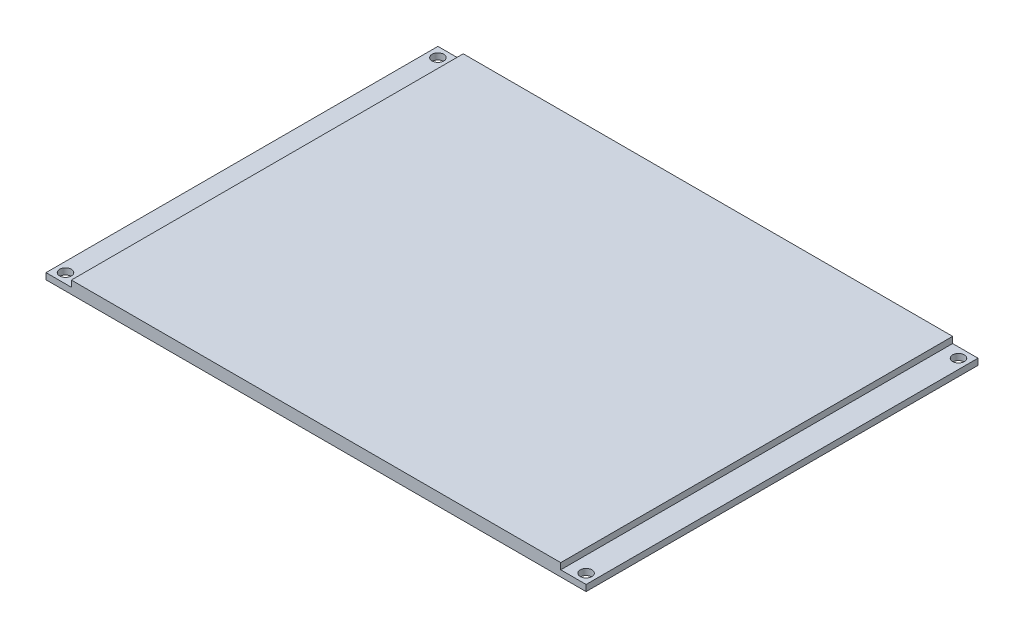
ISO-10303-21;
HEADER;
FILE_DESCRIPTION(('STEP AP214'),'2;1');
FILE_NAME('part.step','',(''),(''),'','','');
FILE_SCHEMA(('AUTOMOTIVE_DESIGN { 1 0 10303 214 1 1 1 1 }'));
ENDSEC;
DATA;
#1=APPLICATION_CONTEXT('core data for automotive mechanical design processes');
#2=APPLICATION_PROTOCOL_DEFINITION('international standard','automotive_design',2000,#1);
#3=PRODUCT_CONTEXT('',#1,'mechanical');
#4=PRODUCT('Part','Part','',(#3));
#5=PRODUCT_RELATED_PRODUCT_CATEGORY('part','',(#4));
#6=PRODUCT_DEFINITION_FORMATION('','',#4);
#7=PRODUCT_DEFINITION_CONTEXT('part definition',#1,'design');
#8=PRODUCT_DEFINITION('design','',#6,#7);
#9=PRODUCT_DEFINITION_SHAPE('','',#8);
#10=(LENGTH_UNIT() NAMED_UNIT(*) SI_UNIT(.MILLI.,.METRE.));
#11=(NAMED_UNIT(*) PLANE_ANGLE_UNIT() SI_UNIT($,.RADIAN.));
#12=(NAMED_UNIT(*) SI_UNIT($,.STERADIAN.) SOLID_ANGLE_UNIT());
#13=UNCERTAINTY_MEASURE_WITH_UNIT(LENGTH_MEASURE(1.E-05),#10,'distance_accuracy_value','');
#14=(GEOMETRIC_REPRESENTATION_CONTEXT(3) GLOBAL_UNCERTAINTY_ASSIGNED_CONTEXT((#13)) GLOBAL_UNIT_ASSIGNED_CONTEXT((#10,
#11,#12)) REPRESENTATION_CONTEXT('',''));
#15=CARTESIAN_POINT('',(0.,0.,0.));
#16=DIRECTION('',(0.,0.,1.));
#17=DIRECTION('',(1.,0.,0.));
#18=AXIS2_PLACEMENT_3D('',#15,#16,#17);
#19=CARTESIAN_POINT('',(0.,0.,0.));
#20=DIRECTION('',(0.,1.,0.));
#21=DIRECTION('',(0.,0.,1.));
#22=AXIS2_PLACEMENT_3D('',#19,#20,#21);
#23=PLANE('',#22);
#24=CARTESIAN_POINT('',(-66.7499999999999,0.,47.75));
#25=DIRECTION('',(0.,1.,0.));
#26=DIRECTION('',(0.,0.,1.));
#27=AXIS2_PLACEMENT_3D('',#24,#25,#26);
#28=CIRCLE('',#27,1.5);
#29=CARTESIAN_POINT('',(-66.7499999999999,0.,49.25));
#30=VERTEX_POINT('',#29);
#31=EDGE_CURVE('E185',#30,#30,#28,.F.);
#32=ORIENTED_EDGE('',*,*,#31,.F.);
#33=EDGE_LOOP('',(#32));
#34=FACE_BOUND('',#33,.T.);
#35=DIRECTION('',(1.,0.,0.));
#36=VECTOR('',#35,1.);
#37=CARTESIAN_POINT('',(0.,0.,50.25));
#38=LINE('',#37,#36);
#39=CARTESIAN_POINT('',(-69.25,0.,50.25));
#40=VERTEX_POINT('',#39);
#41=CARTESIAN_POINT('',(69.25,0.,50.25));
#42=VERTEX_POINT('',#41);
#43=EDGE_CURVE('E216',#40,#42,#38,.T.);
#44=ORIENTED_EDGE('',*,*,#43,.F.);
#45=DIRECTION('',(0.,0.,-1.));
#46=VECTOR('',#45,1.);
#47=CARTESIAN_POINT('',(-69.25,0.,0.));
#48=LINE('',#47,#46);
#49=CARTESIAN_POINT('',(-69.25,0.,-50.25));
#50=VERTEX_POINT('',#49);
#51=EDGE_CURVE('E225',#40,#50,#48,.T.);
#52=ORIENTED_EDGE('',*,*,#51,.T.);
#53=DIRECTION('',(1.,0.,0.));
#54=VECTOR('',#53,1.);
#55=CARTESIAN_POINT('',(0.,0.,-50.25));
#56=LINE('',#55,#54);
#57=CARTESIAN_POINT('',(69.25,0.,-50.25));
#58=VERTEX_POINT('',#57);
#59=EDGE_CURVE('E222',#50,#58,#56,.T.);
#60=ORIENTED_EDGE('',*,*,#59,.T.);
#61=DIRECTION('',(0.,0.,-1.));
#62=VECTOR('',#61,1.);
#63=CARTESIAN_POINT('',(69.25,0.,0.));
#64=LINE('',#63,#62);
#65=EDGE_CURVE('E219',#42,#58,#64,.T.);
#66=ORIENTED_EDGE('',*,*,#65,.F.);
#67=EDGE_LOOP('',(#44,#52,#60,#66));
#68=FACE_BOUND('',#67,.T.);
#69=CARTESIAN_POINT('',(66.75,0.,47.75));
#70=DIRECTION('',(0.,1.,0.));
#71=DIRECTION('',(0.,0.,1.));
#72=AXIS2_PLACEMENT_3D('',#69,#70,#71);
#73=CIRCLE('',#72,1.5);
#74=CARTESIAN_POINT('',(66.75,0.,49.25));
#75=VERTEX_POINT('',#74);
#76=EDGE_CURVE('E213',#75,#75,#73,.T.);
#77=ORIENTED_EDGE('',*,*,#76,.T.);
#78=EDGE_LOOP('',(#77));
#79=FACE_BOUND('',#78,.T.);
#80=CARTESIAN_POINT('',(66.75,0.,-47.75));
#81=DIRECTION('',(0.,1.,0.));
#82=DIRECTION('',(0.,0.,1.));
#83=AXIS2_PLACEMENT_3D('',#80,#81,#82);
#84=CIRCLE('',#83,1.5);
#85=CARTESIAN_POINT('',(66.75,0.,-46.25));
#86=VERTEX_POINT('',#85);
#87=EDGE_CURVE('E210',#86,#86,#84,.F.);
#88=ORIENTED_EDGE('',*,*,#87,.F.);
#89=EDGE_LOOP('',(#88));
#90=FACE_BOUND('',#89,.T.);
#91=CARTESIAN_POINT('',(-66.7499999999999,0.,-47.75));
#92=DIRECTION('',(0.,1.,0.));
#93=DIRECTION('',(0.,0.,1.));
#94=AXIS2_PLACEMENT_3D('',#91,#92,#93);
#95=CIRCLE('',#94,1.5);
#96=CARTESIAN_POINT('',(-66.7499999999999,0.,-46.25));
#97=VERTEX_POINT('',#96);
#98=EDGE_CURVE('E180',#97,#97,#95,.T.);
#99=ORIENTED_EDGE('',*,*,#98,.T.);
#100=EDGE_LOOP('',(#99));
#101=FACE_BOUND('',#100,.T.);
#102=DIRECTION('',(0.,0.,1.));
#103=VECTOR('',#102,1.);
#104=CARTESIAN_POINT('',(55.75,0.,10.25));
#105=LINE('',#104,#103);
#106=CARTESIAN_POINT('',(55.75,0.,-9.75000000000001));
#107=VERTEX_POINT('',#106);
#108=CARTESIAN_POINT('',(55.75,0.,10.25));
#109=VERTEX_POINT('',#108);
#110=EDGE_CURVE('E147',#107,#109,#105,.T.);
#111=ORIENTED_EDGE('',*,*,#110,.F.);
#112=DIRECTION('',(1.,0.,0.));
#113=VECTOR('',#112,1.);
#114=CARTESIAN_POINT('',(47.75,0.,-9.75000000000001));
#115=LINE('',#114,#113);
#116=CARTESIAN_POINT('',(47.75,0.,-9.75000000000001));
#117=VERTEX_POINT('',#116);
#118=EDGE_CURVE('E144',#117,#107,#115,.T.);
#119=ORIENTED_EDGE('',*,*,#118,.F.);
#120=DIRECTION('',(0.,0.,-1.));
#121=VECTOR('',#120,1.);
#122=CARTESIAN_POINT('',(47.75,0.,10.25));
#123=LINE('',#122,#121);
#124=CARTESIAN_POINT('',(47.75,0.,10.25));
#125=VERTEX_POINT('',#124);
#126=EDGE_CURVE('E58',#125,#117,#123,.T.);
#127=ORIENTED_EDGE('',*,*,#126,.F.);
#128=DIRECTION('',(-1.,0.,0.));
#129=VECTOR('',#128,1.);
#130=CARTESIAN_POINT('',(47.75,0.,10.25));
#131=LINE('',#130,#129);
#132=EDGE_CURVE('E53',#109,#125,#131,.T.);
#133=ORIENTED_EDGE('',*,*,#132,.F.);
#134=EDGE_LOOP('',(#111,#119,#127,#133));
#135=FACE_BOUND('',#134,.T.);
#136=ADVANCED_FACE('F38',(#34,#68,#79,#90,#101,#135),#23,.F.);
#137=CARTESIAN_POINT('',(0.,1.6,0.));
#138=DIRECTION('',(0.,1.,0.));
#139=DIRECTION('',(0.,0.,1.));
#140=AXIS2_PLACEMENT_3D('',#137,#138,#139);
#141=PLANE('',#140);
#142=DIRECTION('',(0.,0.,-1.));
#143=VECTOR('',#142,1.);
#144=CARTESIAN_POINT('',(62.75,1.6,50.25));
#145=LINE('',#144,#143);
#146=CARTESIAN_POINT('',(62.75,1.6,50.25));
#147=VERTEX_POINT('',#146);
#148=CARTESIAN_POINT('',(62.75,1.6,-50.25));
#149=VERTEX_POINT('',#148);
#150=EDGE_CURVE('E151',#147,#149,#145,.T.);
#151=ORIENTED_EDGE('',*,*,#150,.F.);
#152=DIRECTION('',(1.,0.,0.));
#153=VECTOR('',#152,1.);
#154=CARTESIAN_POINT('',(0.,1.6,50.25));
#155=LINE('',#154,#153);
#156=CARTESIAN_POINT('',(69.25,1.6,50.25));
#157=VERTEX_POINT('',#156);
#158=EDGE_CURVE('E191',#147,#157,#155,.T.);
#159=ORIENTED_EDGE('',*,*,#158,.T.);
#160=DIRECTION('',(0.,0.,-1.));
#161=VECTOR('',#160,1.);
#162=CARTESIAN_POINT('',(69.25,1.6,0.));
#163=LINE('',#162,#161);
#164=CARTESIAN_POINT('',(69.25,1.6,-50.25));
#165=VERTEX_POINT('',#164);
#166=EDGE_CURVE('E194',#157,#165,#163,.T.);
#167=ORIENTED_EDGE('',*,*,#166,.T.);
#168=DIRECTION('',(1.,0.,0.));
#169=VECTOR('',#168,1.);
#170=CARTESIAN_POINT('',(0.,1.6,-50.25));
#171=LINE('',#170,#169);
#172=EDGE_CURVE('E197',#149,#165,#171,.T.);
#173=ORIENTED_EDGE('',*,*,#172,.F.);
#174=EDGE_LOOP('',(#151,#159,#167,#173));
#175=FACE_BOUND('',#174,.T.);
#176=CARTESIAN_POINT('',(66.75,1.6,47.75));
#177=DIRECTION('',(0.,1.,0.));
#178=DIRECTION('',(0.,0.,1.));
#179=AXIS2_PLACEMENT_3D('',#176,#177,#178);
#180=CIRCLE('',#179,1.5);
#181=CARTESIAN_POINT('',(66.75,1.6,49.25));
#182=VERTEX_POINT('',#181);
#183=EDGE_CURVE('E188',#182,#182,#180,.T.);
#184=ORIENTED_EDGE('',*,*,#183,.F.);
#185=EDGE_LOOP('',(#184));
#186=FACE_BOUND('',#185,.T.);
#187=CARTESIAN_POINT('',(66.75,1.6,-47.75));
#188=DIRECTION('',(0.,1.,0.));
#189=DIRECTION('',(0.,0.,1.));
#190=AXIS2_PLACEMENT_3D('',#187,#188,#189);
#191=CIRCLE('',#190,1.5);
#192=CARTESIAN_POINT('',(66.75,1.6,-46.25));
#193=VERTEX_POINT('',#192);
#194=EDGE_CURVE('E184',#193,#193,#191,.F.);
#195=ORIENTED_EDGE('',*,*,#194,.T.);
#196=EDGE_LOOP('',(#195));
#197=FACE_BOUND('',#196,.T.);
#198=ADVANCED_FACE('F269',(#175,#186,#197),#141,.T.);
#199=CARTESIAN_POINT('',(0.,1.6,50.25));
#200=DIRECTION('',(0.,0.,-1.));
#201=DIRECTION('',(-1.,0.,0.));
#202=AXIS2_PLACEMENT_3D('',#199,#200,#201);
#203=PLANE('',#202);
#204=ORIENTED_EDGE('',*,*,#43,.T.);
#205=DIRECTION('',(0.,-1.,0.));
#206=VECTOR('',#205,1.);
#207=CARTESIAN_POINT('',(69.25,1.6,50.25));
#208=LINE('',#207,#206);
#209=EDGE_CURVE('E11',#157,#42,#208,.T.);
#210=ORIENTED_EDGE('',*,*,#209,.F.);
#211=ORIENTED_EDGE('',*,*,#158,.F.);
#212=DIRECTION('',(0.,-1.,0.));
#213=VECTOR('',#212,1.);
#214=CARTESIAN_POINT('',(62.75,3.2,50.25));
#215=LINE('',#214,#213);
#216=CARTESIAN_POINT('',(62.75,3.2,50.25));
#217=VERTEX_POINT('',#216);
#218=EDGE_CURVE('E171',#217,#147,#215,.T.);
#219=ORIENTED_EDGE('',*,*,#218,.F.);
#220=DIRECTION('',(1.,0.,0.));
#221=VECTOR('',#220,1.);
#222=CARTESIAN_POINT('',(-62.75,3.2,50.25));
#223=LINE('',#222,#221);
#224=CARTESIAN_POINT('',(-62.75,3.2,50.25));
#225=VERTEX_POINT('',#224);
#226=EDGE_CURVE('E162',#225,#217,#223,.T.);
#227=ORIENTED_EDGE('',*,*,#226,.F.);
#228=DIRECTION('',(0.,-1.,0.));
#229=VECTOR('',#228,1.);
#230=CARTESIAN_POINT('',(-62.75,3.2,50.25));
#231=LINE('',#230,#229);
#232=CARTESIAN_POINT('',(-62.75,1.6,50.25));
#233=VERTEX_POINT('',#232);
#234=EDGE_CURVE('E174',#225,#233,#231,.T.);
#235=ORIENTED_EDGE('',*,*,#234,.T.);
#236=CARTESIAN_POINT('',(-69.25,1.6,50.25));
#237=VERTEX_POINT('',#236);
#238=EDGE_CURVE('E192',#237,#233,#155,.T.);
#239=ORIENTED_EDGE('',*,*,#238,.F.);
#240=DIRECTION('',(0.,-1.,0.));
#241=VECTOR('',#240,1.);
#242=CARTESIAN_POINT('',(-69.25,1.6,50.25));
#243=LINE('',#242,#241);
#244=EDGE_CURVE('E207',#237,#40,#243,.T.);
#245=ORIENTED_EDGE('',*,*,#244,.T.);
#246=EDGE_LOOP('',(#204,#210,#211,#219,#227,#235,#239,#245));
#247=FACE_BOUND('',#246,.T.);
#248=ADVANCED_FACE('F258',(#247),#203,.F.);
#249=CARTESIAN_POINT('',(69.25,1.6,0.));
#250=DIRECTION('',(-1.,0.,0.));
#251=DIRECTION('',(0.,0.,1.));
#252=AXIS2_PLACEMENT_3D('',#249,#250,#251);
#253=PLANE('',#252);
#254=ORIENTED_EDGE('',*,*,#65,.T.);
#255=DIRECTION('',(0.,-1.,0.));
#256=VECTOR('',#255,1.);
#257=CARTESIAN_POINT('',(69.25,1.6,-50.25));
#258=LINE('',#257,#256);
#259=EDGE_CURVE('E46',#165,#58,#258,.T.);
#260=ORIENTED_EDGE('',*,*,#259,.F.);
#261=ORIENTED_EDGE('',*,*,#166,.F.);
#262=ORIENTED_EDGE('',*,*,#209,.T.);
#263=EDGE_LOOP('',(#254,#260,#261,#262));
#264=FACE_BOUND('',#263,.T.);
#265=ADVANCED_FACE('F238',(#264),#253,.F.);
#266=CARTESIAN_POINT('',(0.,1.6,-50.25));
#267=DIRECTION('',(0.,0.,-1.));
#268=DIRECTION('',(-1.,0.,0.));
#269=AXIS2_PLACEMENT_3D('',#266,#267,#268);
#270=PLANE('',#269);
#271=ORIENTED_EDGE('',*,*,#59,.F.);
#272=DIRECTION('',(0.,-1.,0.));
#273=VECTOR('',#272,1.);
#274=CARTESIAN_POINT('',(-69.25,1.6,-50.25));
#275=LINE('',#274,#273);
#276=CARTESIAN_POINT('',(-69.25,1.6,-50.25));
#277=VERTEX_POINT('',#276);
#278=EDGE_CURVE('E231',#277,#50,#275,.T.);
#279=ORIENTED_EDGE('',*,*,#278,.F.);
#280=CARTESIAN_POINT('',(-62.75,1.6,-50.25));
#281=VERTEX_POINT('',#280);
#282=EDGE_CURVE('E198',#277,#281,#171,.T.);
#283=ORIENTED_EDGE('',*,*,#282,.T.);
#284=DIRECTION('',(0.,-1.,0.));
#285=VECTOR('',#284,1.);
#286=CARTESIAN_POINT('',(-62.75,3.2,-50.25));
#287=LINE('',#286,#285);
#288=CARTESIAN_POINT('',(-62.75,3.2,-50.25));
#289=VERTEX_POINT('',#288);
#290=EDGE_CURVE('E177',#289,#281,#287,.T.);
#291=ORIENTED_EDGE('',*,*,#290,.F.);
#292=DIRECTION('',(-1.,0.,0.));
#293=VECTOR('',#292,1.);
#294=CARTESIAN_POINT('',(62.75,3.2,-50.25));
#295=LINE('',#294,#293);
#296=CARTESIAN_POINT('',(62.75,3.2,-50.25));
#297=VERTEX_POINT('',#296);
#298=EDGE_CURVE('E157',#297,#289,#295,.T.);
#299=ORIENTED_EDGE('',*,*,#298,.F.);
#300=DIRECTION('',(0.,-1.,0.));
#301=VECTOR('',#300,1.);
#302=CARTESIAN_POINT('',(62.75,3.2,-50.25));
#303=LINE('',#302,#301);
#304=EDGE_CURVE('E165',#297,#149,#303,.T.);
#305=ORIENTED_EDGE('',*,*,#304,.T.);
#306=ORIENTED_EDGE('',*,*,#172,.T.);
#307=ORIENTED_EDGE('',*,*,#259,.T.);
#308=EDGE_LOOP('',(#271,#279,#283,#291,#299,#305,#306,#307));
#309=FACE_BOUND('',#308,.T.);
#310=ADVANCED_FACE('F235',(#309),#270,.T.);
#311=CARTESIAN_POINT('',(-69.25,1.6,0.));
#312=DIRECTION('',(-1.,0.,0.));
#313=DIRECTION('',(0.,0.,1.));
#314=AXIS2_PLACEMENT_3D('',#311,#312,#313);
#315=PLANE('',#314);
#316=ORIENTED_EDGE('',*,*,#51,.F.);
#317=ORIENTED_EDGE('',*,*,#244,.F.);
#318=DIRECTION('',(0.,0.,-1.));
#319=VECTOR('',#318,1.);
#320=CARTESIAN_POINT('',(-69.25,1.6,0.));
#321=LINE('',#320,#319);
#322=EDGE_CURVE('E201',#237,#277,#321,.T.);
#323=ORIENTED_EDGE('',*,*,#322,.T.);
#324=ORIENTED_EDGE('',*,*,#278,.T.);
#325=EDGE_LOOP('',(#316,#317,#323,#324));
#326=FACE_BOUND('',#325,.T.);
#327=ADVANCED_FACE('F245',(#326),#315,.T.);
#328=CARTESIAN_POINT('',(66.75,1.6,47.75));
#329=DIRECTION('',(0.,-1.,0.));
#330=DIRECTION('',(0.,0.,-1.));
#331=AXIS2_PLACEMENT_3D('',#328,#329,#330);
#332=CYLINDRICAL_SURFACE('',#331,1.5);
#333=ORIENTED_EDGE('',*,*,#183,.T.);
#334=EDGE_LOOP('',(#333));
#335=FACE_BOUND('',#334,.T.);
#336=ORIENTED_EDGE('',*,*,#76,.F.);
#337=EDGE_LOOP('',(#336));
#338=FACE_BOUND('',#337,.T.);
#339=ADVANCED_FACE('F280',(#335,#338),#332,.F.);
#340=CARTESIAN_POINT('',(66.75,1.6,-47.75));
#341=DIRECTION('',(0.,-1.,0.));
#342=DIRECTION('',(0.,0.,-1.));
#343=AXIS2_PLACEMENT_3D('',#340,#341,#342);
#344=CYLINDRICAL_SURFACE('',#343,1.5);
#345=ORIENTED_EDGE('',*,*,#194,.F.);
#346=EDGE_LOOP('',(#345));
#347=FACE_BOUND('',#346,.T.);
#348=ORIENTED_EDGE('',*,*,#87,.T.);
#349=EDGE_LOOP('',(#348));
#350=FACE_BOUND('',#349,.T.);
#351=ADVANCED_FACE('F277',(#347,#350),#344,.F.);
#352=CARTESIAN_POINT('',(-66.7499999999999,1.6,-47.75));
#353=DIRECTION('',(0.,-1.,0.));
#354=DIRECTION('',(0.,0.,-1.));
#355=AXIS2_PLACEMENT_3D('',#352,#353,#354);
#356=CYLINDRICAL_SURFACE('',#355,1.5);
#357=CARTESIAN_POINT('',(-66.7499999999999,1.6,-47.75));
#358=DIRECTION('',(0.,1.,0.));
#359=DIRECTION('',(0.,0.,1.));
#360=AXIS2_PLACEMENT_3D('',#357,#358,#359);
#361=CIRCLE('',#360,1.5);
#362=CARTESIAN_POINT('',(-66.7499999999999,1.6,-46.25));
#363=VERTEX_POINT('',#362);
#364=EDGE_CURVE('E181',#363,#363,#361,.T.);
#365=ORIENTED_EDGE('',*,*,#364,.T.);
#366=EDGE_LOOP('',(#365));
#367=FACE_BOUND('',#366,.T.);
#368=ORIENTED_EDGE('',*,*,#98,.F.);
#369=EDGE_LOOP('',(#368));
#370=FACE_BOUND('',#369,.T.);
#371=ADVANCED_FACE('F40',(#367,#370),#356,.F.);
#372=CARTESIAN_POINT('',(-66.7499999999999,1.6,47.75));
#373=DIRECTION('',(0.,-1.,0.));
#374=DIRECTION('',(0.,0.,-1.));
#375=AXIS2_PLACEMENT_3D('',#372,#373,#374);
#376=CYLINDRICAL_SURFACE('',#375,1.5);
#377=CARTESIAN_POINT('',(-66.7499999999999,1.6,47.75));
#378=DIRECTION('',(0.,1.,0.));
#379=DIRECTION('',(0.,0.,1.));
#380=AXIS2_PLACEMENT_3D('',#377,#378,#379);
#381=CIRCLE('',#380,1.5);
#382=CARTESIAN_POINT('',(-66.7499999999999,1.6,49.25));
#383=VERTEX_POINT('',#382);
#384=EDGE_CURVE('E204',#383,#383,#381,.F.);
#385=ORIENTED_EDGE('',*,*,#384,.F.);
#386=EDGE_LOOP('',(#385));
#387=FACE_BOUND('',#386,.T.);
#388=ORIENTED_EDGE('',*,*,#31,.T.);
#389=EDGE_LOOP('',(#388));
#390=FACE_BOUND('',#389,.T.);
#391=ADVANCED_FACE('F321',(#387,#390),#376,.F.);
#392=DIRECTION('',(0.,0.,1.));
#393=VECTOR('',#392,1.);
#394=CARTESIAN_POINT('',(-62.75,1.6,-50.25));
#395=LINE('',#394,#393);
#396=EDGE_CURVE('E148',#281,#233,#395,.T.);
#397=ORIENTED_EDGE('',*,*,#396,.F.);
#398=ORIENTED_EDGE('',*,*,#282,.F.);
#399=ORIENTED_EDGE('',*,*,#322,.F.);
#400=ORIENTED_EDGE('',*,*,#238,.T.);
#401=EDGE_LOOP('',(#397,#398,#399,#400));
#402=FACE_BOUND('',#401,.T.);
#403=ORIENTED_EDGE('',*,*,#364,.F.);
#404=EDGE_LOOP('',(#403));
#405=FACE_BOUND('',#404,.T.);
#406=ORIENTED_EDGE('',*,*,#384,.T.);
#407=EDGE_LOOP('',(#406));
#408=FACE_BOUND('',#407,.T.);
#409=ADVANCED_FACE('F251',(#402,#405,#408),#141,.T.);
#410=CARTESIAN_POINT('',(-62.75,3.2,-50.25));
#411=DIRECTION('',(1.,0.,0.));
#412=DIRECTION('',(0.,0.,-1.));
#413=AXIS2_PLACEMENT_3D('',#410,#411,#412);
#414=PLANE('',#413);
#415=ORIENTED_EDGE('',*,*,#396,.T.);
#416=ORIENTED_EDGE('',*,*,#234,.F.);
#417=DIRECTION('',(0.,0.,1.));
#418=VECTOR('',#417,1.);
#419=CARTESIAN_POINT('',(-62.75,3.2,-50.25));
#420=LINE('',#419,#418);
#421=EDGE_CURVE('E160',#289,#225,#420,.T.);
#422=ORIENTED_EDGE('',*,*,#421,.F.);
#423=ORIENTED_EDGE('',*,*,#290,.T.);
#424=EDGE_LOOP('',(#415,#416,#422,#423));
#425=FACE_BOUND('',#424,.T.);
#426=ADVANCED_FACE('F255',(#425),#414,.F.);
#427=CARTESIAN_POINT('',(62.75,3.2,50.25));
#428=DIRECTION('',(-1.,0.,0.));
#429=DIRECTION('',(0.,0.,1.));
#430=AXIS2_PLACEMENT_3D('',#427,#428,#429);
#431=PLANE('',#430);
#432=ORIENTED_EDGE('',*,*,#150,.T.);
#433=ORIENTED_EDGE('',*,*,#304,.F.);
#434=DIRECTION('',(0.,0.,-1.));
#435=VECTOR('',#434,1.);
#436=CARTESIAN_POINT('',(62.75,3.2,50.25));
#437=LINE('',#436,#435);
#438=EDGE_CURVE('E164',#217,#297,#437,.T.);
#439=ORIENTED_EDGE('',*,*,#438,.F.);
#440=ORIENTED_EDGE('',*,*,#218,.T.);
#441=EDGE_LOOP('',(#432,#433,#439,#440));
#442=FACE_BOUND('',#441,.T.);
#443=ADVANCED_FACE('F267',(#442),#431,.F.);
#444=CARTESIAN_POINT('',(0.,3.2,0.));
#445=DIRECTION('',(0.,1.,0.));
#446=DIRECTION('',(0.,0.,1.));
#447=AXIS2_PLACEMENT_3D('',#444,#445,#446);
#448=PLANE('',#447);
#449=ORIENTED_EDGE('',*,*,#298,.T.);
#450=ORIENTED_EDGE('',*,*,#421,.T.);
#451=ORIENTED_EDGE('',*,*,#226,.T.);
#452=ORIENTED_EDGE('',*,*,#438,.T.);
#453=EDGE_LOOP('',(#449,#450,#451,#452));
#454=FACE_BOUND('',#453,.T.);
#455=ADVANCED_FACE('F263',(#454),#448,.T.);
#456=CARTESIAN_POINT('',(55.75,-6.,10.25));
#457=DIRECTION('',(-1.,0.,0.));
#458=DIRECTION('',(0.,0.,1.));
#459=AXIS2_PLACEMENT_3D('',#456,#457,#458);
#460=PLANE('',#459);
#461=ORIENTED_EDGE('',*,*,#110,.T.);
#462=DIRECTION('',(0.,1.,0.));
#463=VECTOR('',#462,1.);
#464=CARTESIAN_POINT('',(55.75,-6.,10.25));
#465=LINE('',#464,#463);
#466=CARTESIAN_POINT('',(55.75,-6.,10.25));
#467=VERTEX_POINT('',#466);
#468=EDGE_CURVE('E128',#467,#109,#465,.T.);
#469=ORIENTED_EDGE('',*,*,#468,.F.);
#470=DIRECTION('',(0.,0.,1.));
#471=VECTOR('',#470,1.);
#472=CARTESIAN_POINT('',(55.75,-6.,10.25));
#473=LINE('',#472,#471);
#474=CARTESIAN_POINT('',(55.75,-6.,-9.75000000000001));
#475=VERTEX_POINT('',#474);
#476=EDGE_CURVE('E135',#475,#467,#473,.T.);
#477=ORIENTED_EDGE('',*,*,#476,.F.);
#478=DIRECTION('',(0.,1.,0.));
#479=VECTOR('',#478,1.);
#480=CARTESIAN_POINT('',(55.75,-6.,-9.75000000000001));
#481=LINE('',#480,#479);
#482=EDGE_CURVE('E293',#475,#107,#481,.T.);
#483=ORIENTED_EDGE('',*,*,#482,.T.);
#484=EDGE_LOOP('',(#461,#469,#477,#483));
#485=FACE_BOUND('',#484,.T.);
#486=ADVANCED_FACE('F146',(#485),#460,.F.);
#487=CARTESIAN_POINT('',(47.75,-6.,10.25));
#488=DIRECTION('',(0.,0.,-1.));
#489=DIRECTION('',(-1.,0.,0.));
#490=AXIS2_PLACEMENT_3D('',#487,#488,#489);
#491=PLANE('',#490);
#492=ORIENTED_EDGE('',*,*,#132,.T.);
#493=DIRECTION('',(0.,1.,0.));
#494=VECTOR('',#493,1.);
#495=CARTESIAN_POINT('',(47.75,-6.,10.25));
#496=LINE('',#495,#494);
#497=CARTESIAN_POINT('',(47.75,-6.,10.25));
#498=VERTEX_POINT('',#497);
#499=EDGE_CURVE('E131',#498,#125,#496,.T.);
#500=ORIENTED_EDGE('',*,*,#499,.F.);
#501=DIRECTION('',(-1.,0.,0.));
#502=VECTOR('',#501,1.);
#503=CARTESIAN_POINT('',(47.75,-6.,10.25));
#504=LINE('',#503,#502);
#505=EDGE_CURVE('E124',#467,#498,#504,.T.);
#506=ORIENTED_EDGE('',*,*,#505,.F.);
#507=ORIENTED_EDGE('',*,*,#468,.T.);
#508=EDGE_LOOP('',(#492,#500,#506,#507));
#509=FACE_BOUND('',#508,.T.);
#510=ADVANCED_FACE('F126',(#509),#491,.F.);
#511=CARTESIAN_POINT('',(47.75,-6.,10.25));
#512=DIRECTION('',(1.,0.,0.));
#513=DIRECTION('',(0.,0.,-1.));
#514=AXIS2_PLACEMENT_3D('',#511,#512,#513);
#515=PLANE('',#514);
#516=ORIENTED_EDGE('',*,*,#126,.T.);
#517=DIRECTION('',(0.,1.,0.));
#518=VECTOR('',#517,1.);
#519=CARTESIAN_POINT('',(47.75,-6.,-9.75000000000001));
#520=LINE('',#519,#518);
#521=CARTESIAN_POINT('',(47.75,-6.,-9.75000000000001));
#522=VERTEX_POINT('',#521);
#523=EDGE_CURVE('E153',#522,#117,#520,.T.);
#524=ORIENTED_EDGE('',*,*,#523,.F.);
#525=DIRECTION('',(0.,0.,-1.));
#526=VECTOR('',#525,1.);
#527=CARTESIAN_POINT('',(47.75,-6.,10.25));
#528=LINE('',#527,#526);
#529=EDGE_CURVE('E134',#498,#522,#528,.T.);
#530=ORIENTED_EDGE('',*,*,#529,.F.);
#531=ORIENTED_EDGE('',*,*,#499,.T.);
#532=EDGE_LOOP('',(#516,#524,#530,#531));
#533=FACE_BOUND('',#532,.T.);
#534=ADVANCED_FACE('F302',(#533),#515,.F.);
#535=CARTESIAN_POINT('',(47.75,-6.,-9.75000000000001));
#536=DIRECTION('',(0.,0.,1.));
#537=DIRECTION('',(1.,0.,0.));
#538=AXIS2_PLACEMENT_3D('',#535,#536,#537);
#539=PLANE('',#538);
#540=ORIENTED_EDGE('',*,*,#118,.T.);
#541=ORIENTED_EDGE('',*,*,#482,.F.);
#542=DIRECTION('',(1.,0.,0.));
#543=VECTOR('',#542,1.);
#544=CARTESIAN_POINT('',(47.75,-6.,-9.75000000000001));
#545=LINE('',#544,#543);
#546=EDGE_CURVE('E140',#522,#475,#545,.T.);
#547=ORIENTED_EDGE('',*,*,#546,.F.);
#548=ORIENTED_EDGE('',*,*,#523,.T.);
#549=EDGE_LOOP('',(#540,#541,#547,#548));
#550=FACE_BOUND('',#549,.T.);
#551=ADVANCED_FACE('F292',(#550),#539,.F.);
#552=CARTESIAN_POINT('',(0.,-6.,0.));
#553=DIRECTION('',(0.,-1.,0.));
#554=DIRECTION('',(0.,0.,-1.));
#555=AXIS2_PLACEMENT_3D('',#552,#553,#554);
#556=PLANE('',#555);
#557=ORIENTED_EDGE('',*,*,#476,.T.);
#558=ORIENTED_EDGE('',*,*,#505,.T.);
#559=ORIENTED_EDGE('',*,*,#529,.T.);
#560=ORIENTED_EDGE('',*,*,#546,.T.);
#561=EDGE_LOOP('',(#557,#558,#559,#560));
#562=FACE_BOUND('',#561,.T.);
#563=ADVANCED_FACE('F138',(#562),#556,.T.);
#564=CLOSED_SHELL('',(#136,#198,#248,#265,#310,#327,#339,#351,#371,#391,#409,#426,#443,#455,
#486,#510,#534,#551,#563));
#565=MANIFOLD_SOLID_BREP('B2',#564);
#566=ADVANCED_BREP_SHAPE_REPRESENTATION('',(#18,#565),#14);
#567=SHAPE_DEFINITION_REPRESENTATION(#9,#566);
ENDSEC;
END-ISO-10303-21;
